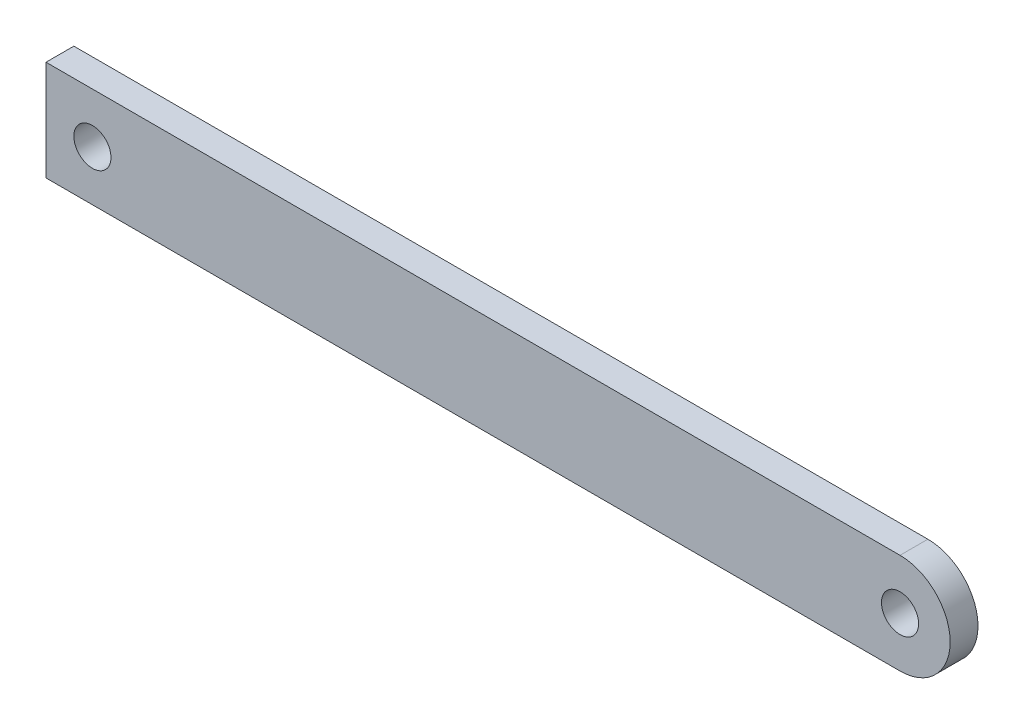
ISO-10303-21;
HEADER;
FILE_DESCRIPTION(('STEP AP214'),'2;1');
FILE_NAME('part.step','',(''),(''),'','','');
FILE_SCHEMA(('AUTOMOTIVE_DESIGN { 1 0 10303 214 1 1 1 1 }'));
ENDSEC;
DATA;
#1=APPLICATION_CONTEXT('core data for automotive mechanical design processes');
#2=APPLICATION_PROTOCOL_DEFINITION('international standard','automotive_design',2000,#1);
#3=PRODUCT_CONTEXT('',#1,'mechanical');
#4=PRODUCT('Part','Part','',(#3));
#5=PRODUCT_RELATED_PRODUCT_CATEGORY('part','',(#4));
#6=PRODUCT_DEFINITION_FORMATION('','',#4);
#7=PRODUCT_DEFINITION_CONTEXT('part definition',#1,'design');
#8=PRODUCT_DEFINITION('design','',#6,#7);
#9=PRODUCT_DEFINITION_SHAPE('','',#8);
#10=(LENGTH_UNIT() NAMED_UNIT(*) SI_UNIT(.MILLI.,.METRE.));
#11=(NAMED_UNIT(*) PLANE_ANGLE_UNIT() SI_UNIT($,.RADIAN.));
#12=(NAMED_UNIT(*) SI_UNIT($,.STERADIAN.) SOLID_ANGLE_UNIT());
#13=UNCERTAINTY_MEASURE_WITH_UNIT(LENGTH_MEASURE(1.E-05),#10,'distance_accuracy_value','');
#14=(GEOMETRIC_REPRESENTATION_CONTEXT(3) GLOBAL_UNCERTAINTY_ASSIGNED_CONTEXT((#13)) GLOBAL_UNIT_ASSIGNED_CONTEXT((#10,
#11,#12)) REPRESENTATION_CONTEXT('',''));
#15=CARTESIAN_POINT('',(0.,0.,0.));
#16=DIRECTION('',(0.,0.,1.));
#17=DIRECTION('',(1.,0.,0.));
#18=AXIS2_PLACEMENT_3D('',#15,#16,#17);
#19=CARTESIAN_POINT('',(230.,4.49640324973188E-12,-15.));
#20=DIRECTION('',(0.,0.,1.));
#21=DIRECTION('',(1.,0.,0.));
#22=AXIS2_PLACEMENT_3D('',#19,#20,#21);
#23=CYLINDRICAL_SURFACE('',#22,27.);
#24=CARTESIAN_POINT('',(230.,4.49640324973188E-12,0.));
#25=DIRECTION('',(0.,0.,1.));
#26=DIRECTION('',(-1.,0.,0.));
#27=AXIS2_PLACEMENT_3D('',#24,#25,#26);
#28=CIRCLE('',#27,27.);
#29=CARTESIAN_POINT('',(230.,-27.,0.));
#30=VERTEX_POINT('',#29);
#31=CARTESIAN_POINT('',(230.,27.,0.));
#32=VERTEX_POINT('',#31);
#33=EDGE_CURVE('E102',#30,#32,#28,.T.);
#34=ORIENTED_EDGE('',*,*,#33,.F.);
#35=DIRECTION('',(0.,0.,1.));
#36=VECTOR('',#35,1.);
#37=CARTESIAN_POINT('',(230.,-27.,-15.));
#38=LINE('',#37,#36);
#39=CARTESIAN_POINT('',(230.,-27.,-15.));
#40=VERTEX_POINT('',#39);
#41=EDGE_CURVE('E11',#40,#30,#38,.T.);
#42=ORIENTED_EDGE('',*,*,#41,.F.);
#43=CARTESIAN_POINT('',(230.,4.49640324973188E-12,-15.));
#44=DIRECTION('',(0.,0.,1.));
#45=DIRECTION('',(-1.,0.,0.));
#46=AXIS2_PLACEMENT_3D('',#43,#44,#45);
#47=CIRCLE('',#46,27.);
#48=CARTESIAN_POINT('',(230.,27.,-15.));
#49=VERTEX_POINT('',#48);
#50=EDGE_CURVE('E100',#40,#49,#47,.T.);
#51=ORIENTED_EDGE('',*,*,#50,.T.);
#52=DIRECTION('',(0.,0.,1.));
#53=VECTOR('',#52,1.);
#54=CARTESIAN_POINT('',(230.,27.,-15.));
#55=LINE('',#54,#53);
#56=EDGE_CURVE('E45',#49,#32,#55,.T.);
#57=ORIENTED_EDGE('',*,*,#56,.T.);
#58=EDGE_LOOP('',(#34,#42,#51,#57));
#59=FACE_BOUND('',#58,.T.);
#60=ADVANCED_FACE('F39',(#59),#23,.T.);
#61=CARTESIAN_POINT('',(-230.,-27.,-15.));
#62=DIRECTION('',(0.,-1.,0.));
#63=DIRECTION('',(0.,0.,-1.));
#64=AXIS2_PLACEMENT_3D('',#61,#62,#63);
#65=PLANE('',#64);
#66=DIRECTION('',(1.,0.,0.));
#67=VECTOR('',#66,1.);
#68=CARTESIAN_POINT('',(-230.,-27.,0.));
#69=LINE('',#68,#67);
#70=CARTESIAN_POINT('',(-230.,-27.,0.));
#71=VERTEX_POINT('',#70);
#72=EDGE_CURVE('E97',#71,#30,#69,.T.);
#73=ORIENTED_EDGE('',*,*,#72,.F.);
#74=DIRECTION('',(0.,0.,1.));
#75=VECTOR('',#74,1.);
#76=CARTESIAN_POINT('',(-230.,-27.,-15.));
#77=LINE('',#76,#75);
#78=CARTESIAN_POINT('',(-230.,-27.,-15.));
#79=VERTEX_POINT('',#78);
#80=EDGE_CURVE('E48',#79,#71,#77,.T.);
#81=ORIENTED_EDGE('',*,*,#80,.F.);
#82=DIRECTION('',(1.,0.,0.));
#83=VECTOR('',#82,1.);
#84=CARTESIAN_POINT('',(-230.,-27.,-15.));
#85=LINE('',#84,#83);
#86=EDGE_CURVE('E94',#79,#40,#85,.T.);
#87=ORIENTED_EDGE('',*,*,#86,.T.);
#88=ORIENTED_EDGE('',*,*,#41,.T.);
#89=EDGE_LOOP('',(#73,#81,#87,#88));
#90=FACE_BOUND('',#89,.T.);
#91=ADVANCED_FACE('F113',(#90),#65,.T.);
#92=CARTESIAN_POINT('',(-230.,-27.,-15.));
#93=DIRECTION('',(-1.,0.,0.));
#94=DIRECTION('',(0.,0.,1.));
#95=AXIS2_PLACEMENT_3D('',#92,#93,#94);
#96=PLANE('',#95);
#97=DIRECTION('',(0.,-1.,0.));
#98=VECTOR('',#97,1.);
#99=CARTESIAN_POINT('',(-230.,-27.,0.));
#100=LINE('',#99,#98);
#101=CARTESIAN_POINT('',(-230.,27.,0.));
#102=VERTEX_POINT('',#101);
#103=EDGE_CURVE('E90',#102,#71,#100,.T.);
#104=ORIENTED_EDGE('',*,*,#103,.F.);
#105=DIRECTION('',(0.,0.,1.));
#106=VECTOR('',#105,1.);
#107=CARTESIAN_POINT('',(-230.,27.,-15.));
#108=LINE('',#107,#106);
#109=CARTESIAN_POINT('',(-230.,27.,-15.));
#110=VERTEX_POINT('',#109);
#111=EDGE_CURVE('E84',#110,#102,#108,.T.);
#112=ORIENTED_EDGE('',*,*,#111,.F.);
#113=DIRECTION('',(0.,-1.,0.));
#114=VECTOR('',#113,1.);
#115=CARTESIAN_POINT('',(-230.,-27.,-15.));
#116=LINE('',#115,#114);
#117=EDGE_CURVE('E87',#110,#79,#116,.T.);
#118=ORIENTED_EDGE('',*,*,#117,.T.);
#119=ORIENTED_EDGE('',*,*,#80,.T.);
#120=EDGE_LOOP('',(#104,#112,#118,#119));
#121=FACE_BOUND('',#120,.T.);
#122=ADVANCED_FACE('F88',(#121),#96,.T.);
#123=CARTESIAN_POINT('',(-230.,27.,-15.));
#124=DIRECTION('',(0.,1.,0.));
#125=DIRECTION('',(0.,0.,1.));
#126=AXIS2_PLACEMENT_3D('',#123,#124,#125);
#127=PLANE('',#126);
#128=DIRECTION('',(-1.,0.,0.));
#129=VECTOR('',#128,1.);
#130=CARTESIAN_POINT('',(-230.,27.,0.));
#131=LINE('',#130,#129);
#132=EDGE_CURVE('E110',#32,#102,#131,.T.);
#133=ORIENTED_EDGE('',*,*,#132,.F.);
#134=ORIENTED_EDGE('',*,*,#56,.F.);
#135=DIRECTION('',(-1.,0.,0.));
#136=VECTOR('',#135,1.);
#137=CARTESIAN_POINT('',(-230.,27.,-15.));
#138=LINE('',#137,#136);
#139=EDGE_CURVE('E91',#49,#110,#138,.T.);
#140=ORIENTED_EDGE('',*,*,#139,.T.);
#141=ORIENTED_EDGE('',*,*,#111,.T.);
#142=EDGE_LOOP('',(#133,#134,#140,#141));
#143=FACE_BOUND('',#142,.T.);
#144=ADVANCED_FACE('F96',(#143),#127,.T.);
#145=CARTESIAN_POINT('',(230.,4.49640324973188E-12,-15.));
#146=DIRECTION('',(0.,0.,-1.));
#147=DIRECTION('',(-1.,0.,0.));
#148=AXIS2_PLACEMENT_3D('',#145,#146,#147);
#149=PLANE('',#148);
#150=CARTESIAN_POINT('',(230.,4.49640324973188E-12,-15.));
#151=DIRECTION('',(0.,0.,1.));
#152=DIRECTION('',(-1.,0.,0.));
#153=AXIS2_PLACEMENT_3D('',#150,#151,#152);
#154=CIRCLE('',#153,9.99999999999869);
#155=CARTESIAN_POINT('',(220.000000000001,4.49640324973188E-12,-15.));
#156=VERTEX_POINT('',#155);
#157=EDGE_CURVE('E146',#156,#156,#154,.T.);
#158=ORIENTED_EDGE('',*,*,#157,.T.);
#159=EDGE_LOOP('',(#158));
#160=FACE_BOUND('',#159,.T.);
#161=CARTESIAN_POINT('',(-205.,0.,-15.));
#162=DIRECTION('',(0.,0.,1.));
#163=DIRECTION('',(1.,0.,0.));
#164=AXIS2_PLACEMENT_3D('',#161,#162,#163);
#165=CIRCLE('',#164,10.);
#166=CARTESIAN_POINT('',(-195.,0.,-15.));
#167=VERTEX_POINT('',#166);
#168=EDGE_CURVE('E107',#167,#167,#165,.T.);
#169=ORIENTED_EDGE('',*,*,#168,.T.);
#170=EDGE_LOOP('',(#169));
#171=FACE_BOUND('',#170,.T.);
#172=ORIENTED_EDGE('',*,*,#50,.F.);
#173=ORIENTED_EDGE('',*,*,#86,.F.);
#174=ORIENTED_EDGE('',*,*,#117,.F.);
#175=ORIENTED_EDGE('',*,*,#139,.F.);
#176=EDGE_LOOP('',(#172,#173,#174,#175));
#177=FACE_BOUND('',#176,.T.);
#178=ADVANCED_FACE('F95',(#160,#171,#177),#149,.T.);
#179=CARTESIAN_POINT('',(230.,4.49640324973188E-12,0.));
#180=DIRECTION('',(0.,0.,-1.));
#181=DIRECTION('',(-1.,0.,0.));
#182=AXIS2_PLACEMENT_3D('',#179,#180,#181);
#183=PLANE('',#182);
#184=CARTESIAN_POINT('',(230.,4.49640324973188E-12,0.));
#185=DIRECTION('',(0.,0.,1.));
#186=DIRECTION('',(-1.,0.,0.));
#187=AXIS2_PLACEMENT_3D('',#184,#185,#186);
#188=CIRCLE('',#187,9.99999999999869);
#189=CARTESIAN_POINT('',(220.000000000001,4.49640324973188E-12,0.));
#190=VERTEX_POINT('',#189);
#191=EDGE_CURVE('E151',#190,#190,#188,.T.);
#192=ORIENTED_EDGE('',*,*,#191,.F.);
#193=EDGE_LOOP('',(#192));
#194=FACE_BOUND('',#193,.T.);
#195=CARTESIAN_POINT('',(-205.,0.,0.));
#196=DIRECTION('',(0.,0.,1.));
#197=DIRECTION('',(1.,0.,0.));
#198=AXIS2_PLACEMENT_3D('',#195,#196,#197);
#199=CIRCLE('',#198,10.);
#200=CARTESIAN_POINT('',(-195.,0.,0.));
#201=VERTEX_POINT('',#200);
#202=EDGE_CURVE('E153',#201,#201,#199,.T.);
#203=ORIENTED_EDGE('',*,*,#202,.F.);
#204=EDGE_LOOP('',(#203));
#205=FACE_BOUND('',#204,.T.);
#206=ORIENTED_EDGE('',*,*,#33,.T.);
#207=ORIENTED_EDGE('',*,*,#132,.T.);
#208=ORIENTED_EDGE('',*,*,#103,.T.);
#209=ORIENTED_EDGE('',*,*,#72,.T.);
#210=EDGE_LOOP('',(#206,#207,#208,#209));
#211=FACE_BOUND('',#210,.T.);
#212=ADVANCED_FACE('F111',(#194,#205,#211),#183,.F.);
#213=CARTESIAN_POINT('',(-205.,0.,-15.));
#214=DIRECTION('',(0.,0.,1.));
#215=DIRECTION('',(1.,0.,0.));
#216=AXIS2_PLACEMENT_3D('',#213,#214,#215);
#217=CYLINDRICAL_SURFACE('',#216,10.);
#218=ORIENTED_EDGE('',*,*,#168,.F.);
#219=EDGE_LOOP('',(#218));
#220=FACE_BOUND('',#219,.T.);
#221=ORIENTED_EDGE('',*,*,#202,.T.);
#222=EDGE_LOOP('',(#221));
#223=FACE_BOUND('',#222,.T.);
#224=ADVANCED_FACE('F132',(#220,#223),#217,.F.);
#225=CARTESIAN_POINT('',(230.,4.49640324973188E-12,-15.));
#226=DIRECTION('',(0.,0.,1.));
#227=DIRECTION('',(1.,0.,0.));
#228=AXIS2_PLACEMENT_3D('',#225,#226,#227);
#229=CYLINDRICAL_SURFACE('',#228,9.99999999999869);
#230=ORIENTED_EDGE('',*,*,#157,.F.);
#231=EDGE_LOOP('',(#230));
#232=FACE_BOUND('',#231,.T.);
#233=ORIENTED_EDGE('',*,*,#191,.T.);
#234=EDGE_LOOP('',(#233));
#235=FACE_BOUND('',#234,.T.);
#236=ADVANCED_FACE('F137',(#232,#235),#229,.F.);
#237=CLOSED_SHELL('',(#60,#91,#122,#144,#178,#212,#224,#236));
#238=MANIFOLD_SOLID_BREP('B2',#237);
#239=ADVANCED_BREP_SHAPE_REPRESENTATION('',(#18,#238),#14);
#240=SHAPE_DEFINITION_REPRESENTATION(#9,#239);
ENDSEC;
END-ISO-10303-21;
